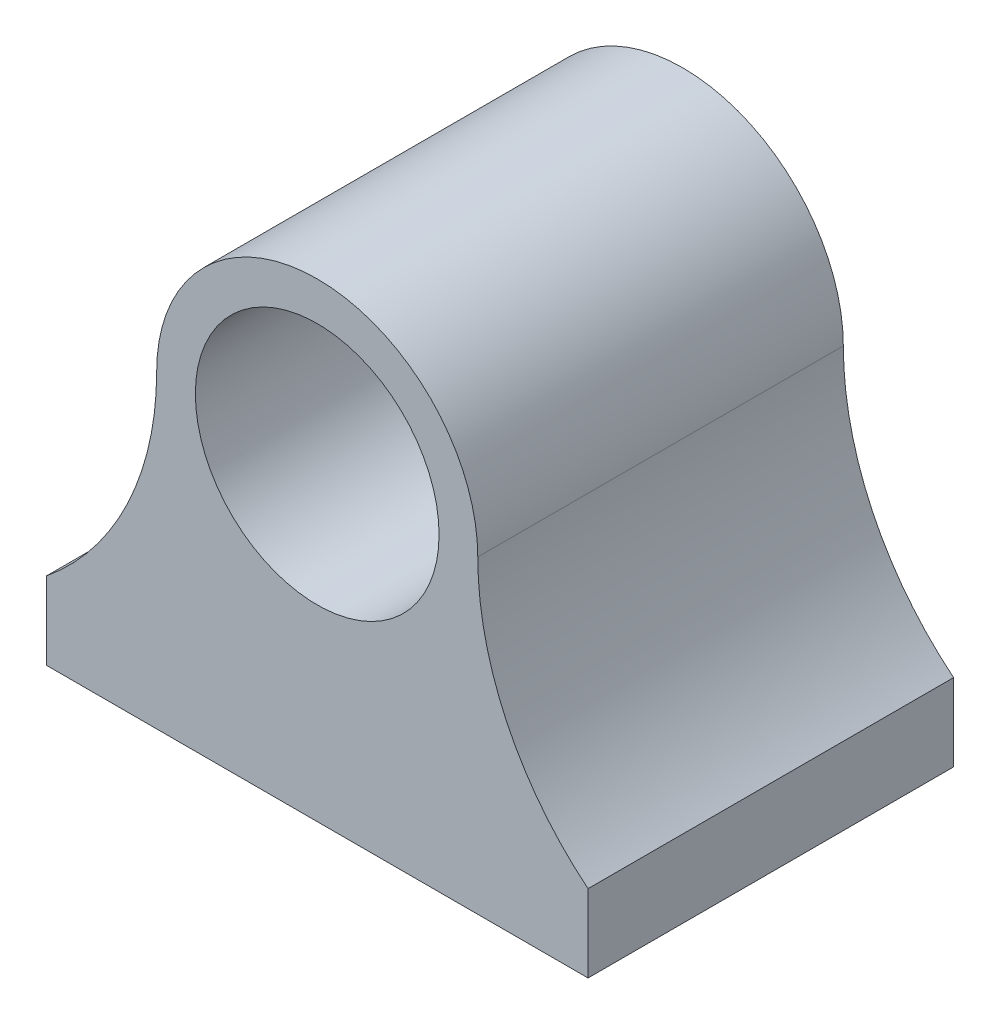
ISO-10303-21;
HEADER;
FILE_DESCRIPTION(('STEP AP214'),'2;1');
FILE_NAME('part.step','',(''),(''),'','','');
FILE_SCHEMA(('AUTOMOTIVE_DESIGN { 1 0 10303 214 1 1 1 1 }'));
ENDSEC;
DATA;
#1=APPLICATION_CONTEXT('core data for automotive mechanical design processes');
#2=APPLICATION_PROTOCOL_DEFINITION('international standard','automotive_design',2000,#1);
#3=PRODUCT_CONTEXT('',#1,'mechanical');
#4=PRODUCT('Part','Part','',(#3));
#5=PRODUCT_RELATED_PRODUCT_CATEGORY('part','',(#4));
#6=PRODUCT_DEFINITION_FORMATION('','',#4);
#7=PRODUCT_DEFINITION_CONTEXT('part definition',#1,'design');
#8=PRODUCT_DEFINITION('design','',#6,#7);
#9=PRODUCT_DEFINITION_SHAPE('','',#8);
#10=(LENGTH_UNIT() NAMED_UNIT(*) SI_UNIT(.MILLI.,.METRE.));
#11=(NAMED_UNIT(*) PLANE_ANGLE_UNIT() SI_UNIT($,.RADIAN.));
#12=(NAMED_UNIT(*) SI_UNIT($,.STERADIAN.) SOLID_ANGLE_UNIT());
#13=UNCERTAINTY_MEASURE_WITH_UNIT(LENGTH_MEASURE(1.E-05),#10,'distance_accuracy_value','');
#14=(GEOMETRIC_REPRESENTATION_CONTEXT(3) GLOBAL_UNCERTAINTY_ASSIGNED_CONTEXT((#13)) GLOBAL_UNIT_ASSIGNED_CONTEXT((#10,
#11,#12)) REPRESENTATION_CONTEXT('',''));
#15=CARTESIAN_POINT('',(0.,0.,0.));
#16=DIRECTION('',(0.,0.,1.));
#17=DIRECTION('',(1.,0.,0.));
#18=AXIS2_PLACEMENT_3D('',#15,#16,#17);
#19=CARTESIAN_POINT('',(37.749861878453,0.,30.));
#20=DIRECTION('',(0.,0.,-1.));
#21=DIRECTION('',(-1.,0.,0.));
#22=AXIS2_PLACEMENT_3D('',#19,#20,#21);
#23=CYLINDRICAL_SURFACE('',#22,24.574861878453);
#24=CARTESIAN_POINT('',(37.749861878453,0.,0.));
#25=DIRECTION('',(0.,0.,1.));
#26=DIRECTION('',(1.,0.,0.));
#27=AXIS2_PLACEMENT_3D('',#24,#25,#26);
#28=CIRCLE('',#27,24.574861878453);
#29=CARTESIAN_POINT('',(13.175,0.,0.));
#30=VERTEX_POINT('',#29);
#31=CARTESIAN_POINT('',(22.225,-19.05,0.));
#32=VERTEX_POINT('',#31);
#33=EDGE_CURVE('E120',#30,#32,#28,.T.);
#34=ORIENTED_EDGE('',*,*,#33,.F.);
#35=DIRECTION('',(0.,0.,-1.));
#36=VECTOR('',#35,1.);
#37=CARTESIAN_POINT('',(13.175,0.,30.));
#38=LINE('',#37,#36);
#39=CARTESIAN_POINT('',(13.175,0.,30.));
#40=VERTEX_POINT('',#39);
#41=EDGE_CURVE('E11',#40,#30,#38,.T.);
#42=ORIENTED_EDGE('',*,*,#41,.F.);
#43=CARTESIAN_POINT('',(37.749861878453,0.,30.));
#44=DIRECTION('',(0.,0.,1.));
#45=DIRECTION('',(1.,0.,0.));
#46=AXIS2_PLACEMENT_3D('',#43,#44,#45);
#47=CIRCLE('',#46,24.574861878453);
#48=CARTESIAN_POINT('',(22.225,-19.05,30.));
#49=VERTEX_POINT('',#48);
#50=EDGE_CURVE('E136',#40,#49,#47,.T.);
#51=ORIENTED_EDGE('',*,*,#50,.T.);
#52=DIRECTION('',(0.,0.,-1.));
#53=VECTOR('',#52,1.);
#54=CARTESIAN_POINT('',(22.225,-19.05,30.));
#55=LINE('',#54,#53);
#56=EDGE_CURVE('E49',#49,#32,#55,.T.);
#57=ORIENTED_EDGE('',*,*,#56,.T.);
#58=EDGE_LOOP('',(#34,#42,#51,#57));
#59=FACE_BOUND('',#58,.T.);
#60=ADVANCED_FACE('F33',(#59),#23,.F.);
#61=CARTESIAN_POINT('',(0.,0.,30.));
#62=DIRECTION('',(0.,0.,-1.));
#63=DIRECTION('',(-1.,0.,0.));
#64=AXIS2_PLACEMENT_3D('',#61,#62,#63);
#65=CYLINDRICAL_SURFACE('',#64,13.175);
#66=CARTESIAN_POINT('',(0.,0.,0.));
#67=DIRECTION('',(0.,0.,1.));
#68=DIRECTION('',(1.,0.,0.));
#69=AXIS2_PLACEMENT_3D('',#66,#67,#68);
#70=CIRCLE('',#69,13.175);
#71=CARTESIAN_POINT('',(-13.175,0.,0.));
#72=VERTEX_POINT('',#71);
#73=EDGE_CURVE('E122',#30,#72,#70,.T.);
#74=ORIENTED_EDGE('',*,*,#73,.T.);
#75=DIRECTION('',(0.,0.,-1.));
#76=VECTOR('',#75,1.);
#77=CARTESIAN_POINT('',(-13.175,0.,30.));
#78=LINE('',#77,#76);
#79=CARTESIAN_POINT('',(-13.175,0.,30.));
#80=VERTEX_POINT('',#79);
#81=EDGE_CURVE('E41',#80,#72,#78,.T.);
#82=ORIENTED_EDGE('',*,*,#81,.F.);
#83=CARTESIAN_POINT('',(0.,0.,30.));
#84=DIRECTION('',(0.,0.,1.));
#85=DIRECTION('',(1.,0.,0.));
#86=AXIS2_PLACEMENT_3D('',#83,#84,#85);
#87=CIRCLE('',#86,13.175);
#88=EDGE_CURVE('E112',#40,#80,#87,.T.);
#89=ORIENTED_EDGE('',*,*,#88,.F.);
#90=ORIENTED_EDGE('',*,*,#41,.T.);
#91=EDGE_LOOP('',(#74,#82,#89,#90));
#92=FACE_BOUND('',#91,.T.);
#93=ADVANCED_FACE('F161',(#92),#65,.T.);
#94=CARTESIAN_POINT('',(-37.7498618784531,0.,30.));
#95=DIRECTION('',(0.,0.,-1.));
#96=DIRECTION('',(-1.,0.,0.));
#97=AXIS2_PLACEMENT_3D('',#94,#95,#96);
#98=CYLINDRICAL_SURFACE('',#97,24.5748618784531);
#99=CARTESIAN_POINT('',(-37.7498618784531,0.,0.));
#100=DIRECTION('',(0.,0.,1.));
#101=DIRECTION('',(1.,0.,0.));
#102=AXIS2_PLACEMENT_3D('',#99,#100,#101);
#103=CIRCLE('',#102,24.5748618784531);
#104=CARTESIAN_POINT('',(-22.225,-19.05,0.));
#105=VERTEX_POINT('',#104);
#106=EDGE_CURVE('E124',#72,#105,#103,.F.);
#107=ORIENTED_EDGE('',*,*,#106,.T.);
#108=DIRECTION('',(0.,0.,-1.));
#109=VECTOR('',#108,1.);
#110=CARTESIAN_POINT('',(-22.225,-19.05,30.));
#111=LINE('',#110,#109);
#112=CARTESIAN_POINT('',(-22.225,-19.05,30.));
#113=VERTEX_POINT('',#112);
#114=EDGE_CURVE('E97',#113,#105,#111,.T.);
#115=ORIENTED_EDGE('',*,*,#114,.F.);
#116=CARTESIAN_POINT('',(-37.7498618784531,0.,30.));
#117=DIRECTION('',(0.,0.,1.));
#118=DIRECTION('',(1.,0.,0.));
#119=AXIS2_PLACEMENT_3D('',#116,#117,#118);
#120=CIRCLE('',#119,24.5748618784531);
#121=EDGE_CURVE('E109',#80,#113,#120,.F.);
#122=ORIENTED_EDGE('',*,*,#121,.F.);
#123=ORIENTED_EDGE('',*,*,#81,.T.);
#124=EDGE_LOOP('',(#107,#115,#122,#123));
#125=FACE_BOUND('',#124,.T.);
#126=ADVANCED_FACE('F143',(#125),#98,.F.);
#127=CARTESIAN_POINT('',(-22.225,0.,30.));
#128=DIRECTION('',(-1.,0.,0.));
#129=DIRECTION('',(0.,0.,1.));
#130=AXIS2_PLACEMENT_3D('',#127,#128,#129);
#131=PLANE('',#130);
#132=DIRECTION('',(0.,1.,0.));
#133=VECTOR('',#132,1.);
#134=CARTESIAN_POINT('',(-22.225,0.,0.));
#135=LINE('',#134,#133);
#136=CARTESIAN_POINT('',(-22.225,-25.4,0.));
#137=VERTEX_POINT('',#136);
#138=EDGE_CURVE('E94',#137,#105,#135,.T.);
#139=ORIENTED_EDGE('',*,*,#138,.F.);
#140=DIRECTION('',(0.,0.,-1.));
#141=VECTOR('',#140,1.);
#142=CARTESIAN_POINT('',(-22.225,-25.4,30.));
#143=LINE('',#142,#141);
#144=CARTESIAN_POINT('',(-22.225,-25.4,30.));
#145=VERTEX_POINT('',#144);
#146=EDGE_CURVE('E88',#145,#137,#143,.T.);
#147=ORIENTED_EDGE('',*,*,#146,.F.);
#148=DIRECTION('',(0.,1.,0.));
#149=VECTOR('',#148,1.);
#150=CARTESIAN_POINT('',(-22.225,0.,30.));
#151=LINE('',#150,#149);
#152=EDGE_CURVE('E92',#145,#113,#151,.T.);
#153=ORIENTED_EDGE('',*,*,#152,.T.);
#154=ORIENTED_EDGE('',*,*,#114,.T.);
#155=EDGE_LOOP('',(#139,#147,#153,#154));
#156=FACE_BOUND('',#155,.T.);
#157=ADVANCED_FACE('F90',(#156),#131,.T.);
#158=CARTESIAN_POINT('',(0.,-25.4,30.));
#159=DIRECTION('',(0.,1.,0.));
#160=DIRECTION('',(0.,0.,1.));
#161=AXIS2_PLACEMENT_3D('',#158,#159,#160);
#162=PLANE('',#161);
#163=DIRECTION('',(1.,0.,0.));
#164=VECTOR('',#163,1.);
#165=CARTESIAN_POINT('',(0.,-25.4,0.));
#166=LINE('',#165,#164);
#167=CARTESIAN_POINT('',(22.225,-25.4,0.));
#168=VERTEX_POINT('',#167);
#169=EDGE_CURVE('E128',#137,#168,#166,.T.);
#170=ORIENTED_EDGE('',*,*,#169,.T.);
#171=DIRECTION('',(0.,0.,-1.));
#172=VECTOR('',#171,1.);
#173=CARTESIAN_POINT('',(22.225,-25.4,30.));
#174=LINE('',#173,#172);
#175=CARTESIAN_POINT('',(22.225,-25.4,30.));
#176=VERTEX_POINT('',#175);
#177=EDGE_CURVE('E69',#176,#168,#174,.T.);
#178=ORIENTED_EDGE('',*,*,#177,.F.);
#179=DIRECTION('',(1.,0.,0.));
#180=VECTOR('',#179,1.);
#181=CARTESIAN_POINT('',(0.,-25.4,30.));
#182=LINE('',#181,#180);
#183=EDGE_CURVE('E99',#145,#176,#182,.T.);
#184=ORIENTED_EDGE('',*,*,#183,.F.);
#185=ORIENTED_EDGE('',*,*,#146,.T.);
#186=EDGE_LOOP('',(#170,#178,#184,#185));
#187=FACE_BOUND('',#186,.T.);
#188=ADVANCED_FACE('F100',(#187),#162,.F.);
#189=CARTESIAN_POINT('',(22.225,0.,30.));
#190=DIRECTION('',(1.,0.,0.));
#191=DIRECTION('',(0.,1.,0.));
#192=AXIS2_PLACEMENT_3D('',#189,#190,#191);
#193=PLANE('',#192);
#194=DIRECTION('',(0.,-1.,0.));
#195=VECTOR('',#194,1.);
#196=CARTESIAN_POINT('',(22.225,0.,0.));
#197=LINE('',#196,#195);
#198=EDGE_CURVE('E130',#32,#168,#197,.T.);
#199=ORIENTED_EDGE('',*,*,#198,.F.);
#200=ORIENTED_EDGE('',*,*,#56,.F.);
#201=DIRECTION('',(0.,-1.,0.));
#202=VECTOR('',#201,1.);
#203=CARTESIAN_POINT('',(22.225,0.,30.));
#204=LINE('',#203,#202);
#205=EDGE_CURVE('E103',#49,#176,#204,.T.);
#206=ORIENTED_EDGE('',*,*,#205,.T.);
#207=ORIENTED_EDGE('',*,*,#177,.T.);
#208=EDGE_LOOP('',(#199,#200,#206,#207));
#209=FACE_BOUND('',#208,.T.);
#210=ADVANCED_FACE('F149',(#209),#193,.T.);
#211=CARTESIAN_POINT('',(0.,0.,30.));
#212=DIRECTION('',(0.,0.,-1.));
#213=DIRECTION('',(-1.,0.,0.));
#214=AXIS2_PLACEMENT_3D('',#211,#212,#213);
#215=CYLINDRICAL_SURFACE('',#214,10.);
#216=CARTESIAN_POINT('',(0.,0.,30.));
#217=DIRECTION('',(0.,0.,1.));
#218=DIRECTION('',(1.,0.,0.));
#219=AXIS2_PLACEMENT_3D('',#216,#217,#218);
#220=CIRCLE('',#219,10.);
#221=CARTESIAN_POINT('',(10.,0.,30.));
#222=VERTEX_POINT('',#221);
#223=EDGE_CURVE('E117',#222,#222,#220,.T.);
#224=ORIENTED_EDGE('',*,*,#223,.T.);
#225=EDGE_LOOP('',(#224));
#226=FACE_BOUND('',#225,.T.);
#227=CARTESIAN_POINT('',(0.,0.,0.));
#228=DIRECTION('',(0.,0.,1.));
#229=DIRECTION('',(1.,0.,0.));
#230=AXIS2_PLACEMENT_3D('',#227,#228,#229);
#231=CIRCLE('',#230,10.);
#232=CARTESIAN_POINT('',(10.,0.,0.));
#233=VERTEX_POINT('',#232);
#234=EDGE_CURVE('E133',#233,#233,#231,.T.);
#235=ORIENTED_EDGE('',*,*,#234,.F.);
#236=EDGE_LOOP('',(#235));
#237=FACE_BOUND('',#236,.T.);
#238=ADVANCED_FACE('F151',(#226,#237),#215,.F.);
#239=CARTESIAN_POINT('',(0.,0.,30.));
#240=DIRECTION('',(0.,0.,1.));
#241=DIRECTION('',(1.,0.,0.));
#242=AXIS2_PLACEMENT_3D('',#239,#240,#241);
#243=PLANE('',#242);
#244=ORIENTED_EDGE('',*,*,#50,.F.);
#245=ORIENTED_EDGE('',*,*,#88,.T.);
#246=ORIENTED_EDGE('',*,*,#121,.T.);
#247=ORIENTED_EDGE('',*,*,#152,.F.);
#248=ORIENTED_EDGE('',*,*,#183,.T.);
#249=ORIENTED_EDGE('',*,*,#205,.F.);
#250=EDGE_LOOP('',(#244,#245,#246,#247,#248,#249));
#251=FACE_BOUND('',#250,.T.);
#252=ORIENTED_EDGE('',*,*,#223,.F.);
#253=EDGE_LOOP('',(#252));
#254=FACE_BOUND('',#253,.T.);
#255=ADVANCED_FACE('F106',(#251,#254),#243,.T.);
#256=CARTESIAN_POINT('',(0.,0.,0.));
#257=DIRECTION('',(0.,0.,1.));
#258=DIRECTION('',(1.,0.,0.));
#259=AXIS2_PLACEMENT_3D('',#256,#257,#258);
#260=PLANE('',#259);
#261=ORIENTED_EDGE('',*,*,#33,.T.);
#262=ORIENTED_EDGE('',*,*,#198,.T.);
#263=ORIENTED_EDGE('',*,*,#169,.F.);
#264=ORIENTED_EDGE('',*,*,#138,.T.);
#265=ORIENTED_EDGE('',*,*,#106,.F.);
#266=ORIENTED_EDGE('',*,*,#73,.F.);
#267=EDGE_LOOP('',(#261,#262,#263,#264,#265,#266));
#268=FACE_BOUND('',#267,.T.);
#269=ORIENTED_EDGE('',*,*,#234,.T.);
#270=EDGE_LOOP('',(#269));
#271=FACE_BOUND('',#270,.T.);
#272=ADVANCED_FACE('F147',(#268,#271),#260,.F.);
#273=CLOSED_SHELL('',(#60,#93,#126,#157,#188,#210,#238,#255,#272));
#274=MANIFOLD_SOLID_BREP('B2',#273);
#275=ADVANCED_BREP_SHAPE_REPRESENTATION('',(#18,#274),#14);
#276=SHAPE_DEFINITION_REPRESENTATION(#9,#275);
ENDSEC;
END-ISO-10303-21;
